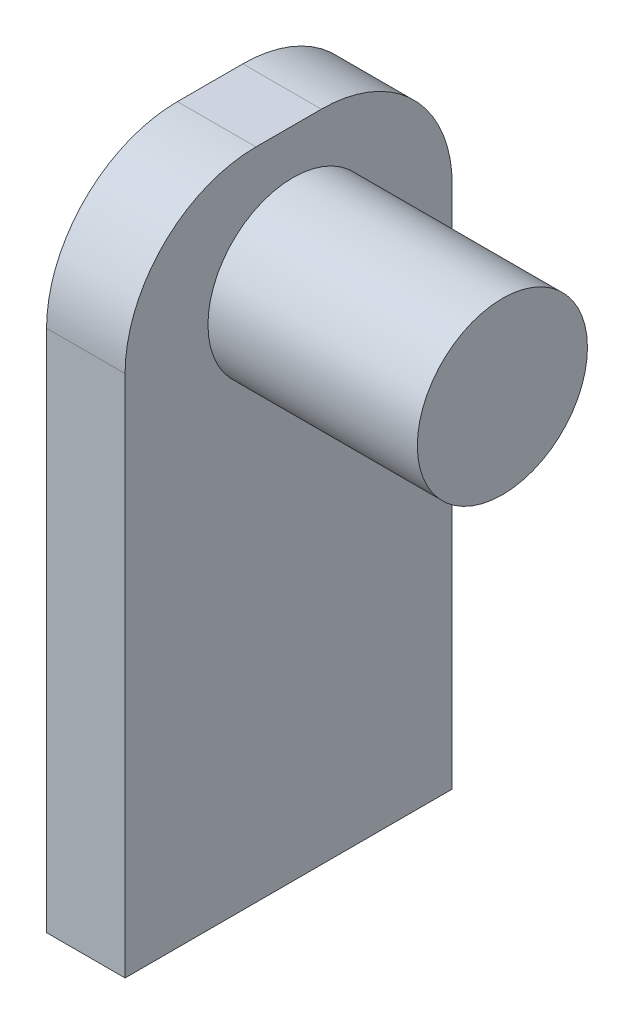
ISO-10303-21;
HEADER;
FILE_DESCRIPTION(('STEP AP214'),'2;1');
FILE_NAME('part.step','',(''),(''),'','','');
FILE_SCHEMA(('AUTOMOTIVE_DESIGN { 1 0 10303 214 1 1 1 1 }'));
ENDSEC;
DATA;
#1=APPLICATION_CONTEXT('core data for automotive mechanical design processes');
#2=APPLICATION_PROTOCOL_DEFINITION('international standard','automotive_design',2000,#1);
#3=PRODUCT_CONTEXT('',#1,'mechanical');
#4=PRODUCT('Part','Part','',(#3));
#5=PRODUCT_RELATED_PRODUCT_CATEGORY('part','',(#4));
#6=PRODUCT_DEFINITION_FORMATION('','',#4);
#7=PRODUCT_DEFINITION_CONTEXT('part definition',#1,'design');
#8=PRODUCT_DEFINITION('design','',#6,#7);
#9=PRODUCT_DEFINITION_SHAPE('','',#8);
#10=(LENGTH_UNIT() NAMED_UNIT(*) SI_UNIT(.MILLI.,.METRE.));
#11=(NAMED_UNIT(*) PLANE_ANGLE_UNIT() SI_UNIT($,.RADIAN.));
#12=(NAMED_UNIT(*) SI_UNIT($,.STERADIAN.) SOLID_ANGLE_UNIT());
#13=UNCERTAINTY_MEASURE_WITH_UNIT(LENGTH_MEASURE(1.E-05),#10,'distance_accuracy_value','');
#14=(GEOMETRIC_REPRESENTATION_CONTEXT(3) GLOBAL_UNCERTAINTY_ASSIGNED_CONTEXT((#13)) GLOBAL_UNIT_ASSIGNED_CONTEXT((#10,
#11,#12)) REPRESENTATION_CONTEXT('',''));
#15=CARTESIAN_POINT('',(0.,0.,0.));
#16=DIRECTION('',(0.,0.,1.));
#17=DIRECTION('',(1.,0.,0.));
#18=AXIS2_PLACEMENT_3D('',#15,#16,#17);
#19=CARTESIAN_POINT('',(6.,-10.0000000000001,25.));
#20=DIRECTION('',(0.,0.,-1.));
#21=DIRECTION('',(0.,1.,0.));
#22=AXIS2_PLACEMENT_3D('',#19,#20,#21);
#23=PLANE('',#22);
#24=DIRECTION('',(0.,-1.,0.));
#25=VECTOR('',#24,1.);
#26=CARTESIAN_POINT('',(0.,-10.0000000000001,25.));
#27=LINE('',#26,#25);
#28=CARTESIAN_POINT('',(0.,-10.0000000000001,25.));
#29=VERTEX_POINT('',#28);
#30=CARTESIAN_POINT('',(0.,-50.,25.));
#31=VERTEX_POINT('',#30);
#32=EDGE_CURVE('E128',#29,#31,#27,.T.);
#33=ORIENTED_EDGE('',*,*,#32,.T.);
#34=DIRECTION('',(-1.,0.,0.));
#35=VECTOR('',#34,1.);
#36=CARTESIAN_POINT('',(6.,-50.,25.));
#37=LINE('',#36,#35);
#38=CARTESIAN_POINT('',(6.,-50.,25.));
#39=VERTEX_POINT('',#38);
#40=EDGE_CURVE('E47',#39,#31,#37,.T.);
#41=ORIENTED_EDGE('',*,*,#40,.F.);
#42=DIRECTION('',(0.,-1.,0.));
#43=VECTOR('',#42,1.);
#44=CARTESIAN_POINT('',(6.,-10.0000000000001,25.));
#45=LINE('',#44,#43);
#46=CARTESIAN_POINT('',(6.,-10.0000000000001,25.));
#47=VERTEX_POINT('',#46);
#48=EDGE_CURVE('E145',#47,#39,#45,.T.);
#49=ORIENTED_EDGE('',*,*,#48,.F.);
#50=DIRECTION('',(-1.,0.,0.));
#51=VECTOR('',#50,1.);
#52=CARTESIAN_POINT('',(6.,-10.0000000000001,25.));
#53=LINE('',#52,#51);
#54=EDGE_CURVE('E124',#47,#29,#53,.T.);
#55=ORIENTED_EDGE('',*,*,#54,.T.);
#56=EDGE_LOOP('',(#33,#41,#49,#55));
#57=FACE_BOUND('',#56,.T.);
#58=ADVANCED_FACE('F38',(#57),#23,.F.);
#59=CARTESIAN_POINT('',(6.,-50.,0.));
#60=DIRECTION('',(0.,1.,0.));
#61=DIRECTION('',(0.,0.,1.));
#62=AXIS2_PLACEMENT_3D('',#59,#60,#61);
#63=PLANE('',#62);
#64=DIRECTION('',(0.,0.,-1.));
#65=VECTOR('',#64,1.);
#66=CARTESIAN_POINT('',(0.,-50.,0.));
#67=LINE('',#66,#65);
#68=CARTESIAN_POINT('',(0.,-50.,0.));
#69=VERTEX_POINT('',#68);
#70=EDGE_CURVE('E132',#31,#69,#67,.T.);
#71=ORIENTED_EDGE('',*,*,#70,.T.);
#72=DIRECTION('',(-1.,0.,0.));
#73=VECTOR('',#72,1.);
#74=CARTESIAN_POINT('',(6.,-50.,0.));
#75=LINE('',#74,#73);
#76=CARTESIAN_POINT('',(6.,-50.,0.));
#77=VERTEX_POINT('',#76);
#78=EDGE_CURVE('E152',#77,#69,#75,.T.);
#79=ORIENTED_EDGE('',*,*,#78,.F.);
#80=DIRECTION('',(0.,0.,-1.));
#81=VECTOR('',#80,1.);
#82=CARTESIAN_POINT('',(6.,-50.,0.));
#83=LINE('',#82,#81);
#84=EDGE_CURVE('E93',#39,#77,#83,.T.);
#85=ORIENTED_EDGE('',*,*,#84,.F.);
#86=ORIENTED_EDGE('',*,*,#40,.T.);
#87=EDGE_LOOP('',(#71,#79,#85,#86));
#88=FACE_BOUND('',#87,.T.);
#89=ADVANCED_FACE('F157',(#88),#63,.F.);
#90=CARTESIAN_POINT('',(6.,-10.0000000000001,0.));
#91=DIRECTION('',(0.,0.,1.));
#92=DIRECTION('',(0.,-1.,0.));
#93=AXIS2_PLACEMENT_3D('',#90,#91,#92);
#94=PLANE('',#93);
#95=DIRECTION('',(0.,1.,0.));
#96=VECTOR('',#95,1.);
#97=CARTESIAN_POINT('',(0.,-10.0000000000001,0.));
#98=LINE('',#97,#96);
#99=CARTESIAN_POINT('',(0.,-10.0000000000001,0.));
#100=VERTEX_POINT('',#99);
#101=EDGE_CURVE('E136',#69,#100,#98,.T.);
#102=ORIENTED_EDGE('',*,*,#101,.T.);
#103=DIRECTION('',(-1.,0.,0.));
#104=VECTOR('',#103,1.);
#105=CARTESIAN_POINT('',(6.,-10.0000000000001,0.));
#106=LINE('',#105,#104);
#107=CARTESIAN_POINT('',(6.,-10.0000000000001,0.));
#108=VERTEX_POINT('',#107);
#109=EDGE_CURVE('E117',#108,#100,#106,.T.);
#110=ORIENTED_EDGE('',*,*,#109,.F.);
#111=DIRECTION('',(0.,1.,0.));
#112=VECTOR('',#111,1.);
#113=CARTESIAN_POINT('',(6.,-10.0000000000001,0.));
#114=LINE('',#113,#112);
#115=EDGE_CURVE('E106',#77,#108,#114,.T.);
#116=ORIENTED_EDGE('',*,*,#115,.F.);
#117=ORIENTED_EDGE('',*,*,#78,.T.);
#118=EDGE_LOOP('',(#102,#110,#116,#117));
#119=FACE_BOUND('',#118,.T.);
#120=ADVANCED_FACE('F165',(#119),#94,.F.);
#121=CARTESIAN_POINT('',(6.,-10.,10.));
#122=DIRECTION('',(-1.,0.,0.));
#123=DIRECTION('',(0.,0.,1.));
#124=AXIS2_PLACEMENT_3D('',#121,#122,#123);
#125=CYLINDRICAL_SURFACE('',#124,10.);
#126=CARTESIAN_POINT('',(0.,-10.,10.));
#127=DIRECTION('',(1.,0.,0.));
#128=DIRECTION('',(0.,0.,1.));
#129=AXIS2_PLACEMENT_3D('',#126,#127,#128);
#130=CIRCLE('',#129,10.);
#131=CARTESIAN_POINT('',(0.,0.,10.0000000000001));
#132=VERTEX_POINT('',#131);
#133=EDGE_CURVE('E115',#100,#132,#130,.T.);
#134=ORIENTED_EDGE('',*,*,#133,.T.);
#135=DIRECTION('',(-1.,0.,0.));
#136=VECTOR('',#135,1.);
#137=CARTESIAN_POINT('',(6.,0.,10.0000000000001));
#138=LINE('',#137,#136);
#139=CARTESIAN_POINT('',(6.,0.,10.0000000000001));
#140=VERTEX_POINT('',#139);
#141=EDGE_CURVE('E112',#140,#132,#138,.T.);
#142=ORIENTED_EDGE('',*,*,#141,.F.);
#143=CARTESIAN_POINT('',(6.,-10.,10.));
#144=DIRECTION('',(1.,0.,0.));
#145=DIRECTION('',(0.,0.,1.));
#146=AXIS2_PLACEMENT_3D('',#143,#144,#145);
#147=CIRCLE('',#146,10.);
#148=EDGE_CURVE('E100',#108,#140,#147,.T.);
#149=ORIENTED_EDGE('',*,*,#148,.F.);
#150=ORIENTED_EDGE('',*,*,#109,.T.);
#151=EDGE_LOOP('',(#134,#142,#149,#150));
#152=FACE_BOUND('',#151,.T.);
#153=ADVANCED_FACE('F113',(#152),#125,.T.);
#154=CARTESIAN_POINT('',(6.,0.,10.0000000000001));
#155=DIRECTION('',(0.,-1.,0.));
#156=DIRECTION('',(0.,0.,-1.));
#157=AXIS2_PLACEMENT_3D('',#154,#155,#156);
#158=PLANE('',#157);
#159=DIRECTION('',(0.,0.,1.));
#160=VECTOR('',#159,1.);
#161=CARTESIAN_POINT('',(0.,0.,10.0000000000001));
#162=LINE('',#161,#160);
#163=CARTESIAN_POINT('',(0.,0.,14.9999999999999));
#164=VERTEX_POINT('',#163);
#165=EDGE_CURVE('E78',#132,#164,#162,.T.);
#166=ORIENTED_EDGE('',*,*,#165,.T.);
#167=DIRECTION('',(-1.,0.,0.));
#168=VECTOR('',#167,1.);
#169=CARTESIAN_POINT('',(6.,0.,14.9999999999999));
#170=LINE('',#169,#168);
#171=CARTESIAN_POINT('',(6.,0.,14.9999999999999));
#172=VERTEX_POINT('',#171);
#173=EDGE_CURVE('E118',#172,#164,#170,.T.);
#174=ORIENTED_EDGE('',*,*,#173,.F.);
#175=DIRECTION('',(0.,0.,1.));
#176=VECTOR('',#175,1.);
#177=CARTESIAN_POINT('',(6.,0.,10.0000000000001));
#178=LINE('',#177,#176);
#179=EDGE_CURVE('E104',#140,#172,#178,.T.);
#180=ORIENTED_EDGE('',*,*,#179,.F.);
#181=ORIENTED_EDGE('',*,*,#141,.T.);
#182=EDGE_LOOP('',(#166,#174,#180,#181));
#183=FACE_BOUND('',#182,.T.);
#184=ADVANCED_FACE('F120',(#183),#158,.F.);
#185=CARTESIAN_POINT('',(6.,-10.,15.));
#186=DIRECTION('',(-1.,0.,0.));
#187=DIRECTION('',(0.,0.,1.));
#188=AXIS2_PLACEMENT_3D('',#185,#186,#187);
#189=CYLINDRICAL_SURFACE('',#188,10.);
#190=CARTESIAN_POINT('',(0.,-10.,15.));
#191=DIRECTION('',(1.,0.,0.));
#192=DIRECTION('',(0.,0.,-1.));
#193=AXIS2_PLACEMENT_3D('',#190,#191,#192);
#194=CIRCLE('',#193,10.);
#195=EDGE_CURVE('E84',#164,#29,#194,.T.);
#196=ORIENTED_EDGE('',*,*,#195,.T.);
#197=ORIENTED_EDGE('',*,*,#54,.F.);
#198=CARTESIAN_POINT('',(6.,-10.,15.));
#199=DIRECTION('',(1.,0.,0.));
#200=DIRECTION('',(0.,0.,-1.));
#201=AXIS2_PLACEMENT_3D('',#198,#199,#200);
#202=CIRCLE('',#201,10.);
#203=EDGE_CURVE('E55',#172,#47,#202,.T.);
#204=ORIENTED_EDGE('',*,*,#203,.F.);
#205=ORIENTED_EDGE('',*,*,#173,.T.);
#206=EDGE_LOOP('',(#196,#197,#204,#205));
#207=FACE_BOUND('',#206,.T.);
#208=ADVANCED_FACE('F204',(#207),#189,.T.);
#209=CARTESIAN_POINT('',(6.,-10.,10.));
#210=DIRECTION('',(-1.,0.,0.));
#211=DIRECTION('',(0.,0.,1.));
#212=AXIS2_PLACEMENT_3D('',#209,#210,#211);
#213=PLANE('',#212);
#214=CARTESIAN_POINT('',(6.,-9.94140323533948,12.1653645163409));
#215=DIRECTION('',(-1.,0.,0.));
#216=DIRECTION('',(0.,0.,1.));
#217=AXIS2_PLACEMENT_3D('',#214,#215,#216);
#218=CIRCLE('',#217,6.5);
#219=CARTESIAN_POINT('',(6.,-9.94140323533948,18.6653645163409));
#220=VERTEX_POINT('',#219);
#221=EDGE_CURVE('E11',#220,#220,#218,.F.);
#222=ORIENTED_EDGE('',*,*,#221,.F.);
#223=EDGE_LOOP('',(#222));
#224=FACE_BOUND('',#223,.T.);
#225=ORIENTED_EDGE('',*,*,#48,.T.);
#226=ORIENTED_EDGE('',*,*,#84,.T.);
#227=ORIENTED_EDGE('',*,*,#115,.T.);
#228=ORIENTED_EDGE('',*,*,#148,.T.);
#229=ORIENTED_EDGE('',*,*,#179,.T.);
#230=ORIENTED_EDGE('',*,*,#203,.T.);
#231=EDGE_LOOP('',(#225,#226,#227,#228,#229,#230));
#232=FACE_BOUND('',#231,.T.);
#233=ADVANCED_FACE('F102',(#224,#232),#213,.F.);
#234=CARTESIAN_POINT('',(0.,-10.,10.));
#235=DIRECTION('',(-1.,0.,0.));
#236=DIRECTION('',(0.,0.,1.));
#237=AXIS2_PLACEMENT_3D('',#234,#235,#236);
#238=PLANE('',#237);
#239=CARTESIAN_POINT('',(0.,-42.8026077306652,12.9015625803909));
#240=DIRECTION('',(-1.,0.,0.));
#241=DIRECTION('',(0.,0.,1.));
#242=AXIS2_PLACEMENT_3D('',#239,#240,#241);
#243=CIRCLE('',#242,2.40937548234568);
#244=CARTESIAN_POINT('',(0.,-42.8026077306652,15.3109380627366));
#245=VERTEX_POINT('',#244);
#246=EDGE_CURVE('E176',#245,#245,#243,.T.);
#247=ORIENTED_EDGE('',*,*,#246,.F.);
#248=EDGE_LOOP('',(#247));
#249=FACE_BOUND('',#248,.T.);
#250=ORIENTED_EDGE('',*,*,#32,.F.);
#251=ORIENTED_EDGE('',*,*,#195,.F.);
#252=ORIENTED_EDGE('',*,*,#165,.F.);
#253=ORIENTED_EDGE('',*,*,#133,.F.);
#254=ORIENTED_EDGE('',*,*,#101,.F.);
#255=ORIENTED_EDGE('',*,*,#70,.F.);
#256=EDGE_LOOP('',(#250,#251,#252,#253,#254,#255));
#257=FACE_BOUND('',#256,.T.);
#258=ADVANCED_FACE('F162',(#249,#257),#238,.T.);
#259=CARTESIAN_POINT('',(22.,-9.94140323533948,12.1653645163409));
#260=DIRECTION('',(-1.,0.,0.));
#261=DIRECTION('',(0.,0.,1.));
#262=AXIS2_PLACEMENT_3D('',#259,#260,#261);
#263=CYLINDRICAL_SURFACE('',#262,6.5);
#264=CARTESIAN_POINT('',(22.,-9.94140323533948,12.1653645163409));
#265=DIRECTION('',(1.,0.,0.));
#266=DIRECTION('',(0.,0.,-1.));
#267=AXIS2_PLACEMENT_3D('',#264,#265,#266);
#268=CIRCLE('',#267,6.5);
#269=CARTESIAN_POINT('',(22.,-9.94140323533948,5.66536451634087));
#270=VERTEX_POINT('',#269);
#271=EDGE_CURVE('E133',#270,#270,#268,.T.);
#272=ORIENTED_EDGE('',*,*,#271,.F.);
#273=EDGE_LOOP('',(#272));
#274=FACE_BOUND('',#273,.T.);
#275=ORIENTED_EDGE('',*,*,#221,.T.);
#276=EDGE_LOOP('',(#275));
#277=FACE_BOUND('',#276,.T.);
#278=ADVANCED_FACE('F194',(#274,#277),#263,.T.);
#279=CARTESIAN_POINT('',(22.,-9.94140323533948,12.1653645163409));
#280=DIRECTION('',(1.,0.,0.));
#281=DIRECTION('',(0.,0.,-1.));
#282=AXIS2_PLACEMENT_3D('',#279,#280,#281);
#283=PLANE('',#282);
#284=ORIENTED_EDGE('',*,*,#271,.T.);
#285=EDGE_LOOP('',(#284));
#286=FACE_BOUND('',#285,.T.);
#287=ADVANCED_FACE('F189',(#286),#283,.T.);
#288=CARTESIAN_POINT('',(2.5,-42.8026077306652,12.9015625803909));
#289=DIRECTION('',(-1.,0.,0.));
#290=DIRECTION('',(0.,0.,1.));
#291=AXIS2_PLACEMENT_3D('',#288,#289,#290);
#292=CYLINDRICAL_SURFACE('',#291,2.40937548234568);
#293=CARTESIAN_POINT('',(2.5,-42.8026077306652,12.9015625803909));
#294=DIRECTION('',(-1.,0.,0.));
#295=DIRECTION('',(0.,0.,1.));
#296=AXIS2_PLACEMENT_3D('',#293,#294,#295);
#297=CIRCLE('',#296,2.40937548234568);
#298=CARTESIAN_POINT('',(2.5,-42.8026077306652,15.3109380627366));
#299=VERTEX_POINT('',#298);
#300=EDGE_CURVE('E175',#299,#299,#297,.T.);
#301=ORIENTED_EDGE('',*,*,#300,.F.);
#302=EDGE_LOOP('',(#301));
#303=FACE_BOUND('',#302,.T.);
#304=ORIENTED_EDGE('',*,*,#246,.T.);
#305=EDGE_LOOP('',(#304));
#306=FACE_BOUND('',#305,.T.);
#307=ADVANCED_FACE('F186',(#303,#306),#292,.F.);
#308=CARTESIAN_POINT('',(2.5,-42.8026077306652,12.9015625803909));
#309=DIRECTION('',(-1.,0.,0.));
#310=DIRECTION('',(0.,0.,1.));
#311=AXIS2_PLACEMENT_3D('',#308,#309,#310);
#312=PLANE('',#311);
#313=ORIENTED_EDGE('',*,*,#300,.T.);
#314=EDGE_LOOP('',(#313));
#315=FACE_BOUND('',#314,.T.);
#316=ADVANCED_FACE('F184',(#315),#312,.T.);
#317=CLOSED_SHELL('',(#58,#89,#120,#153,#184,#208,#233,#258,#278,#287,#307,#316));
#318=MANIFOLD_SOLID_BREP('B2',#317);
#319=ADVANCED_BREP_SHAPE_REPRESENTATION('',(#18,#318),#14);
#320=SHAPE_DEFINITION_REPRESENTATION(#9,#319);
ENDSEC;
END-ISO-10303-21;
